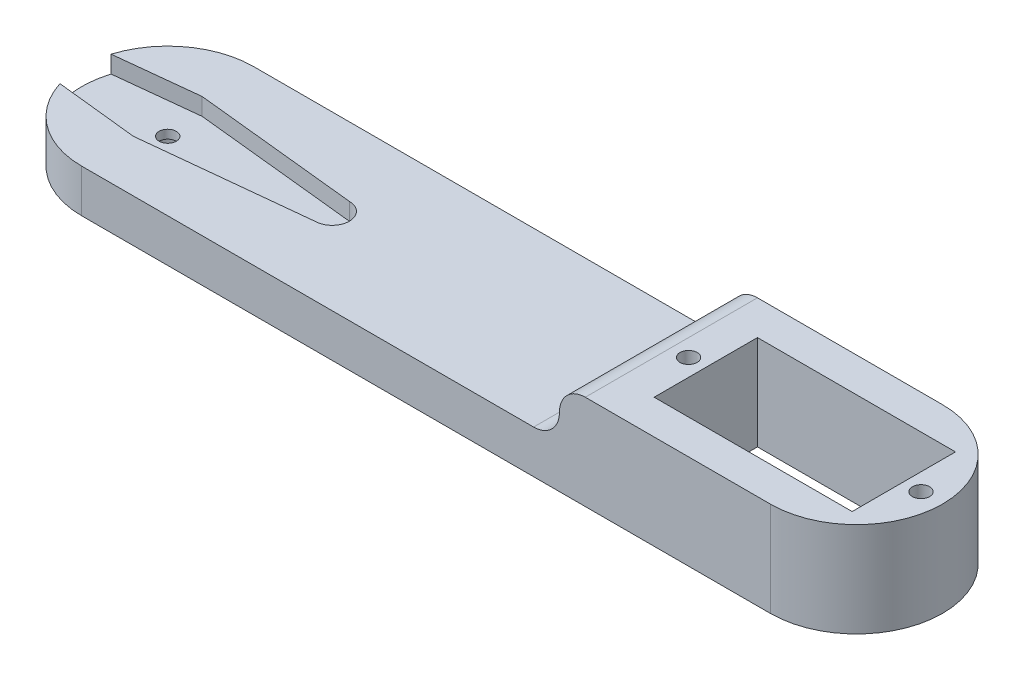
ISO-10303-21;
HEADER;
FILE_DESCRIPTION(('STEP AP214'),'2;1');
FILE_NAME('part.step','',(''),(''),'','','');
FILE_SCHEMA(('AUTOMOTIVE_DESIGN { 1 0 10303 214 1 1 1 1 }'));
ENDSEC;
DATA;
#1=APPLICATION_CONTEXT('core data for automotive mechanical design processes');
#2=APPLICATION_PROTOCOL_DEFINITION('international standard','automotive_design',2000,#1);
#3=PRODUCT_CONTEXT('',#1,'mechanical');
#4=PRODUCT('Part','Part','',(#3));
#5=PRODUCT_RELATED_PRODUCT_CATEGORY('part','',(#4));
#6=PRODUCT_DEFINITION_FORMATION('','',#4);
#7=PRODUCT_DEFINITION_CONTEXT('part definition',#1,'design');
#8=PRODUCT_DEFINITION('design','',#6,#7);
#9=PRODUCT_DEFINITION_SHAPE('','',#8);
#10=(LENGTH_UNIT() NAMED_UNIT(*) SI_UNIT(.MILLI.,.METRE.));
#11=(NAMED_UNIT(*) PLANE_ANGLE_UNIT() SI_UNIT($,.RADIAN.));
#12=(NAMED_UNIT(*) SI_UNIT($,.STERADIAN.) SOLID_ANGLE_UNIT());
#13=UNCERTAINTY_MEASURE_WITH_UNIT(LENGTH_MEASURE(1.E-05),#10,'distance_accuracy_value','');
#14=(GEOMETRIC_REPRESENTATION_CONTEXT(3) GLOBAL_UNCERTAINTY_ASSIGNED_CONTEXT((#13)) GLOBAL_UNIT_ASSIGNED_CONTEXT((#10,
#11,#12)) REPRESENTATION_CONTEXT('',''));
#15=CARTESIAN_POINT('',(0.,0.,0.));
#16=DIRECTION('',(0.,0.,1.));
#17=DIRECTION('',(1.,0.,0.));
#18=AXIS2_PLACEMENT_3D('',#15,#16,#17);
#19=CARTESIAN_POINT('',(47.5,0.,0.));
#20=DIRECTION('',(0.,1.,0.));
#21=DIRECTION('',(0.,0.,1.));
#22=AXIS2_PLACEMENT_3D('',#19,#20,#21);
#23=CYLINDRICAL_SURFACE('',#22,0.999999999999998);
#24=CARTESIAN_POINT('',(47.5,11.,0.));
#25=DIRECTION('',(0.,1.,0.));
#26=DIRECTION('',(0.,0.,1.));
#27=AXIS2_PLACEMENT_3D('',#24,#25,#26);
#28=CIRCLE('',#27,0.999999999999998);
#29=CARTESIAN_POINT('',(47.5,11.,0.999999999999998));
#30=VERTEX_POINT('',#29);
#31=EDGE_CURVE('E248',#30,#30,#28,.T.);
#32=ORIENTED_EDGE('',*,*,#31,.T.);
#33=EDGE_LOOP('',(#32));
#34=FACE_BOUND('',#33,.T.);
#35=CARTESIAN_POINT('',(47.5,4.,0.));
#36=DIRECTION('',(0.,-1.,0.));
#37=DIRECTION('',(0.,0.,-1.));
#38=AXIS2_PLACEMENT_3D('',#35,#36,#37);
#39=CIRCLE('',#38,0.999999999999998);
#40=CARTESIAN_POINT('',(47.5,4.,-0.999999999999998));
#41=VERTEX_POINT('',#40);
#42=EDGE_CURVE('E96',#41,#41,#39,.F.);
#43=ORIENTED_EDGE('',*,*,#42,.F.);
#44=EDGE_LOOP('',(#43));
#45=FACE_BOUND('',#44,.T.);
#46=ADVANCED_FACE('F92',(#34,#45),#23,.F.);
#47=CARTESIAN_POINT('',(20.5,0.,0.));
#48=DIRECTION('',(0.,1.,0.));
#49=DIRECTION('',(0.,0.,1.));
#50=AXIS2_PLACEMENT_3D('',#47,#48,#49);
#51=CYLINDRICAL_SURFACE('',#50,1.);
#52=CARTESIAN_POINT('',(20.5,11.,0.));
#53=DIRECTION('',(0.,1.,0.));
#54=DIRECTION('',(0.,0.,1.));
#55=AXIS2_PLACEMENT_3D('',#52,#53,#54);
#56=CIRCLE('',#55,1.);
#57=CARTESIAN_POINT('',(20.5,11.,1.));
#58=VERTEX_POINT('',#57);
#59=EDGE_CURVE('E252',#58,#58,#56,.T.);
#60=ORIENTED_EDGE('',*,*,#59,.T.);
#61=EDGE_LOOP('',(#60));
#62=FACE_BOUND('',#61,.T.);
#63=CARTESIAN_POINT('',(20.5,4.,0.));
#64=DIRECTION('',(0.,-1.,0.));
#65=DIRECTION('',(0.,0.,-1.));
#66=AXIS2_PLACEMENT_3D('',#63,#64,#65);
#67=CIRCLE('',#66,1.);
#68=CARTESIAN_POINT('',(20.5,4.,-1.));
#69=VERTEX_POINT('',#68);
#70=EDGE_CURVE('E422',#69,#69,#67,.F.);
#71=ORIENTED_EDGE('',*,*,#70,.F.);
#72=EDGE_LOOP('',(#71));
#73=FACE_BOUND('',#72,.T.);
#74=ADVANCED_FACE('F531',(#62,#73),#51,.F.);
#75=CARTESIAN_POINT('',(12.5013276464842,8.,-10.));
#76=DIRECTION('',(0.,0.,1.));
#77=DIRECTION('',(1.,0.,0.));
#78=AXIS2_PLACEMENT_3D('',#75,#76,#77);
#79=CYLINDRICAL_SURFACE('',#78,3.);
#80=DIRECTION('',(0.,0.,1.));
#81=VECTOR('',#80,1.);
#82=CARTESIAN_POINT('',(12.5013276464842,5.,0.));
#83=LINE('',#82,#81);
#84=CARTESIAN_POINT('',(12.5013276464842,5.,10.));
#85=VERTEX_POINT('',#84);
#86=CARTESIAN_POINT('',(12.5013276464841,5.,-10.));
#87=VERTEX_POINT('',#86);
#88=EDGE_CURVE('E418',#85,#87,#83,.F.);
#89=ORIENTED_EDGE('',*,*,#88,.F.);
#90=CARTESIAN_POINT('',(12.5013276464842,8.,10.));
#91=DIRECTION('',(0.,0.,-1.));
#92=DIRECTION('',(-1.,0.,0.));
#93=AXIS2_PLACEMENT_3D('',#90,#91,#92);
#94=CIRCLE('',#93,3.);
#95=CARTESIAN_POINT('',(15.5013276464842,8.,10.));
#96=VERTEX_POINT('',#95);
#97=EDGE_CURVE('E12',#85,#96,#94,.F.);
#98=ORIENTED_EDGE('',*,*,#97,.T.);
#99=DIRECTION('',(0.,0.,1.));
#100=VECTOR('',#99,1.);
#101=CARTESIAN_POINT('',(15.5013276464842,8.,0.));
#102=LINE('',#101,#100);
#103=CARTESIAN_POINT('',(15.5013276464842,8.,-10.));
#104=VERTEX_POINT('',#103);
#105=EDGE_CURVE('E409',#96,#104,#102,.F.);
#106=ORIENTED_EDGE('',*,*,#105,.T.);
#107=CARTESIAN_POINT('',(12.5013276464842,8.,-10.));
#108=DIRECTION('',(0.,0.,1.));
#109=DIRECTION('',(1.,0.,0.));
#110=AXIS2_PLACEMENT_3D('',#107,#108,#109);
#111=CIRCLE('',#110,3.);
#112=EDGE_CURVE('E102',#104,#87,#111,.F.);
#113=ORIENTED_EDGE('',*,*,#112,.T.);
#114=EDGE_LOOP('',(#89,#98,#106,#113));
#115=FACE_BOUND('',#114,.T.);
#116=ADVANCED_FACE('F94',(#115),#79,.F.);
#117=CARTESIAN_POINT('',(18.5013276464842,8.,0.));
#118=DIRECTION('',(0.,0.,-1.));
#119=DIRECTION('',(-1.,0.,0.));
#120=AXIS2_PLACEMENT_3D('',#117,#118,#119);
#121=CYLINDRICAL_SURFACE('',#120,3.);
#122=DIRECTION('',(0.,0.,1.));
#123=VECTOR('',#122,1.);
#124=CARTESIAN_POINT('',(18.5013276464842,11.,0.));
#125=LINE('',#124,#123);
#126=CARTESIAN_POINT('',(18.5013276464842,11.,-10.));
#127=VERTEX_POINT('',#126);
#128=CARTESIAN_POINT('',(18.5013276464842,11.,10.));
#129=VERTEX_POINT('',#128);
#130=EDGE_CURVE('E399',#127,#129,#125,.T.);
#131=ORIENTED_EDGE('',*,*,#130,.F.);
#132=CARTESIAN_POINT('',(18.5013276464842,8.,-10.));
#133=DIRECTION('',(0.,0.,1.));
#134=DIRECTION('',(1.,0.,0.));
#135=AXIS2_PLACEMENT_3D('',#132,#133,#134);
#136=CIRCLE('',#135,3.);
#137=EDGE_CURVE('E412',#104,#127,#136,.F.);
#138=ORIENTED_EDGE('',*,*,#137,.F.);
#139=ORIENTED_EDGE('',*,*,#105,.F.);
#140=CARTESIAN_POINT('',(18.5013276464842,8.,10.));
#141=DIRECTION('',(0.,0.,-1.));
#142=DIRECTION('',(-1.,0.,0.));
#143=AXIS2_PLACEMENT_3D('',#140,#141,#142);
#144=CIRCLE('',#143,3.);
#145=EDGE_CURVE('E415',#129,#96,#144,.F.);
#146=ORIENTED_EDGE('',*,*,#145,.F.);
#147=EDGE_LOOP('',(#131,#138,#139,#146));
#148=FACE_BOUND('',#147,.T.);
#149=ADVANCED_FACE('F475',(#148),#121,.T.);
#150=CARTESIAN_POINT('',(-40.,0.,0.));
#151=DIRECTION('',(0.,1.,0.));
#152=DIRECTION('',(0.,0.,1.));
#153=AXIS2_PLACEMENT_3D('',#150,#151,#152);
#154=CYLINDRICAL_SURFACE('',#153,0.999999999999998);
#155=CARTESIAN_POINT('',(-40.,3.,0.));
#156=DIRECTION('',(0.,1.,0.));
#157=DIRECTION('',(0.,0.,1.));
#158=AXIS2_PLACEMENT_3D('',#155,#156,#157);
#159=CIRCLE('',#158,0.999999999999998);
#160=CARTESIAN_POINT('',(-40.,3.,0.999999999999998));
#161=VERTEX_POINT('',#160);
#162=EDGE_CURVE('E323',#161,#161,#159,.T.);
#163=ORIENTED_EDGE('',*,*,#162,.T.);
#164=EDGE_LOOP('',(#163));
#165=FACE_BOUND('',#164,.T.);
#166=CARTESIAN_POINT('',(-40.,2.,0.));
#167=DIRECTION('',(0.,-1.,0.));
#168=DIRECTION('',(0.,0.,-1.));
#169=AXIS2_PLACEMENT_3D('',#166,#167,#168);
#170=CIRCLE('',#169,0.999999999999998);
#171=CARTESIAN_POINT('',(-40.,2.,-0.999999999999998));
#172=VERTEX_POINT('',#171);
#173=EDGE_CURVE('E291',#172,#172,#170,.F.);
#174=ORIENTED_EDGE('',*,*,#173,.F.);
#175=EDGE_LOOP('',(#174));
#176=FACE_BOUND('',#175,.T.);
#177=ADVANCED_FACE('F563',(#165,#176),#154,.F.);
#178=CARTESIAN_POINT('',(-40.,5.,0.));
#179=DIRECTION('',(0.,-1.,0.));
#180=DIRECTION('',(0.,0.,-1.));
#181=AXIS2_PLACEMENT_3D('',#178,#179,#180);
#182=CYLINDRICAL_SURFACE('',#181,10.);
#183=DIRECTION('',(0.,1.,0.));
#184=VECTOR('',#183,1.);
#185=CARTESIAN_POINT('',(-49.5495147182902,3.,2.96762003045511));
#186=LINE('',#185,#184);
#187=CARTESIAN_POINT('',(-49.5495147182902,3.,2.96762003045511));
#188=VERTEX_POINT('',#187);
#189=CARTESIAN_POINT('',(-49.5495147182902,5.,2.96762003045511));
#190=VERTEX_POINT('',#189);
#191=EDGE_CURVE('E343',#188,#190,#186,.T.);
#192=ORIENTED_EDGE('',*,*,#191,.F.);
#193=CARTESIAN_POINT('',(-40.,3.,0.));
#194=DIRECTION('',(0.,1.,0.));
#195=DIRECTION('',(0.,0.,1.));
#196=AXIS2_PLACEMENT_3D('',#193,#194,#195);
#197=CIRCLE('',#196,10.);
#198=CARTESIAN_POINT('',(-49.5495147182902,3.,-2.96762003045511));
#199=VERTEX_POINT('',#198);
#200=EDGE_CURVE('E310',#199,#188,#197,.T.);
#201=ORIENTED_EDGE('',*,*,#200,.F.);
#202=DIRECTION('',(0.,1.,0.));
#203=VECTOR('',#202,1.);
#204=CARTESIAN_POINT('',(-49.5495147182902,3.,-2.96762003045511));
#205=LINE('',#204,#203);
#206=CARTESIAN_POINT('',(-49.5495147182902,5.,-2.96762003045511));
#207=VERTEX_POINT('',#206);
#208=EDGE_CURVE('E346',#199,#207,#205,.T.);
#209=ORIENTED_EDGE('',*,*,#208,.T.);
#210=CARTESIAN_POINT('',(-40.,5.,0.));
#211=DIRECTION('',(0.,1.,0.));
#212=DIRECTION('',(0.,0.,1.));
#213=AXIS2_PLACEMENT_3D('',#210,#211,#212);
#214=CIRCLE('',#213,10.);
#215=CARTESIAN_POINT('',(-40.,5.,-10.));
#216=VERTEX_POINT('',#215);
#217=EDGE_CURVE('E364',#216,#207,#214,.T.);
#218=ORIENTED_EDGE('',*,*,#217,.F.);
#219=DIRECTION('',(0.,-1.,0.));
#220=VECTOR('',#219,1.);
#221=CARTESIAN_POINT('',(-40.,5.,-10.));
#222=LINE('',#221,#220);
#223=CARTESIAN_POINT('',(-40.,0.,-10.));
#224=VERTEX_POINT('',#223);
#225=EDGE_CURVE('E391',#216,#224,#222,.T.);
#226=ORIENTED_EDGE('',*,*,#225,.T.);
#227=CARTESIAN_POINT('',(-40.,0.,0.));
#228=DIRECTION('',(0.,1.,0.));
#229=DIRECTION('',(0.,0.,1.));
#230=AXIS2_PLACEMENT_3D('',#227,#228,#229);
#231=CIRCLE('',#230,10.);
#232=CARTESIAN_POINT('',(-40.,0.,10.));
#233=VERTEX_POINT('',#232);
#234=EDGE_CURVE('E379',#224,#233,#231,.T.);
#235=ORIENTED_EDGE('',*,*,#234,.T.);
#236=DIRECTION('',(0.,-1.,0.));
#237=VECTOR('',#236,1.);
#238=CARTESIAN_POINT('',(-40.,5.,10.));
#239=LINE('',#238,#237);
#240=CARTESIAN_POINT('',(-40.,5.,10.));
#241=VERTEX_POINT('',#240);
#242=EDGE_CURVE('E387',#241,#233,#239,.T.);
#243=ORIENTED_EDGE('',*,*,#242,.F.);
#244=EDGE_CURVE('E362',#190,#241,#214,.T.);
#245=ORIENTED_EDGE('',*,*,#244,.F.);
#246=EDGE_LOOP('',(#192,#201,#209,#218,#226,#235,#243,#245));
#247=FACE_BOUND('',#246,.T.);
#248=ADVANCED_FACE('F490',(#247),#182,.T.);
#249=CARTESIAN_POINT('',(40.,5.,0.));
#250=DIRECTION('',(0.,1.,0.));
#251=DIRECTION('',(0.,0.,1.));
#252=AXIS2_PLACEMENT_3D('',#249,#250,#251);
#253=PLANE('',#252);
#254=DIRECTION('',(1.,0.,0.));
#255=VECTOR('',#254,1.);
#256=CARTESIAN_POINT('',(-40.,5.,10.));
#257=LINE('',#256,#255);
#258=EDGE_CURVE('E368',#241,#85,#257,.T.);
#259=ORIENTED_EDGE('',*,*,#258,.T.);
#260=ORIENTED_EDGE('',*,*,#88,.T.);
#261=DIRECTION('',(-1.,0.,0.));
#262=VECTOR('',#261,1.);
#263=CARTESIAN_POINT('',(-40.,5.,-10.));
#264=LINE('',#263,#262);
#265=EDGE_CURVE('E359',#87,#216,#264,.T.);
#266=ORIENTED_EDGE('',*,*,#265,.T.);
#267=ORIENTED_EDGE('',*,*,#217,.T.);
#268=DIRECTION('',(0.994207047565849,0.,-0.107481842980092));
#269=VECTOR('',#268,1.);
#270=CARTESIAN_POINT('',(-0.889530685920576,5.,-8.22815884476534));
#271=LINE('',#270,#269);
#272=CARTESIAN_POINT('',(-39.9999999999999,5.,-4.00000000000001));
#273=VERTEX_POINT('',#272);
#274=EDGE_CURVE('E331',#207,#273,#271,.T.);
#275=ORIENTED_EDGE('',*,*,#274,.T.);
#276=DIRECTION('',(0.994559064630482,0.,0.10417421447432));
#277=VECTOR('',#276,1.);
#278=CARTESIAN_POINT('',(-0.0196610412288855,5.,0.187705440093161));
#279=LINE('',#278,#277);
#280=CARTESIAN_POINT('',(-20.9058495012685,5.,-2.00000000000118));
#281=VERTEX_POINT('',#280);
#282=EDGE_CURVE('E327',#273,#281,#279,.T.);
#283=ORIENTED_EDGE('',*,*,#282,.T.);
#284=CARTESIAN_POINT('',(-20.9058495012685,5.,-1.17831092105725E-12));
#285=DIRECTION('',(0.,1.,0.));
#286=DIRECTION('',(0.,0.,1.));
#287=AXIS2_PLACEMENT_3D('',#284,#285,#286);
#288=CIRCLE('',#287,2.);
#289=CARTESIAN_POINT('',(-20.9058495012685,5.,1.99999999999882));
#290=VERTEX_POINT('',#289);
#291=EDGE_CURVE('E322',#290,#281,#288,.T.);
#292=ORIENTED_EDGE('',*,*,#291,.F.);
#293=DIRECTION('',(-0.994559064630469,0.,0.104174214474442));
#294=VECTOR('',#293,1.);
#295=CARTESIAN_POINT('',(-0.0196610412294196,5.,-0.18770544009804));
#296=LINE('',#295,#294);
#297=CARTESIAN_POINT('',(-39.9999999999999,5.,4.00000000000001));
#298=VERTEX_POINT('',#297);
#299=EDGE_CURVE('E318',#290,#298,#296,.T.);
#300=ORIENTED_EDGE('',*,*,#299,.T.);
#301=DIRECTION('',(-0.994207047565849,0.,-0.107481842980092));
#302=VECTOR('',#301,1.);
#303=CARTESIAN_POINT('',(-0.889530685920576,5.,8.22815884476534));
#304=LINE('',#303,#302);
#305=EDGE_CURVE('E300',#298,#190,#304,.T.);
#306=ORIENTED_EDGE('',*,*,#305,.T.);
#307=ORIENTED_EDGE('',*,*,#244,.T.);
#308=EDGE_LOOP('',(#259,#260,#266,#267,#275,#283,#292,#300,#306,#307));
#309=FACE_BOUND('',#308,.T.);
#310=ADVANCED_FACE('F494',(#309),#253,.T.);
#311=CARTESIAN_POINT('',(40.,5.,0.));
#312=DIRECTION('',(0.,-1.,0.));
#313=DIRECTION('',(0.,0.,-1.));
#314=AXIS2_PLACEMENT_3D('',#311,#312,#313);
#315=CYLINDRICAL_SURFACE('',#314,10.);
#316=CARTESIAN_POINT('',(40.,0.,0.));
#317=DIRECTION('',(0.,1.,0.));
#318=DIRECTION('',(0.,0.,1.));
#319=AXIS2_PLACEMENT_3D('',#316,#317,#318);
#320=CIRCLE('',#319,10.);
#321=CARTESIAN_POINT('',(40.,0.,10.));
#322=VERTEX_POINT('',#321);
#323=CARTESIAN_POINT('',(40.,0.,-10.));
#324=VERTEX_POINT('',#323);
#325=EDGE_CURVE('E342',#322,#324,#320,.T.);
#326=ORIENTED_EDGE('',*,*,#325,.T.);
#327=DIRECTION('',(0.,-1.,0.));
#328=VECTOR('',#327,1.);
#329=CARTESIAN_POINT('',(40.,5.,-10.));
#330=LINE('',#329,#328);
#331=CARTESIAN_POINT('',(40.,11.,-10.));
#332=VERTEX_POINT('',#331);
#333=EDGE_CURVE('E395',#332,#324,#330,.T.);
#334=ORIENTED_EDGE('',*,*,#333,.F.);
#335=CARTESIAN_POINT('',(40.,11.,0.));
#336=DIRECTION('',(0.,1.,0.));
#337=DIRECTION('',(0.,0.,1.));
#338=AXIS2_PLACEMENT_3D('',#335,#336,#337);
#339=CIRCLE('',#338,10.);
#340=CARTESIAN_POINT('',(40.,11.,10.));
#341=VERTEX_POINT('',#340);
#342=EDGE_CURVE('E259',#341,#332,#339,.T.);
#343=ORIENTED_EDGE('',*,*,#342,.F.);
#344=DIRECTION('',(0.,-1.,0.));
#345=VECTOR('',#344,1.);
#346=CARTESIAN_POINT('',(40.,5.,10.));
#347=LINE('',#346,#345);
#348=EDGE_CURVE('E372',#341,#322,#347,.T.);
#349=ORIENTED_EDGE('',*,*,#348,.T.);
#350=EDGE_LOOP('',(#326,#334,#343,#349));
#351=FACE_BOUND('',#350,.T.);
#352=ADVANCED_FACE('F466',(#351),#315,.T.);
#353=CARTESIAN_POINT('',(-40.,5.,-10.));
#354=DIRECTION('',(0.,0.,1.));
#355=DIRECTION('',(1.,0.,0.));
#356=AXIS2_PLACEMENT_3D('',#353,#354,#355);
#357=PLANE('',#356);
#358=CARTESIAN_POINT('',(0.,2.5,-10.));
#359=DIRECTION('',(0.,0.,-1.));
#360=DIRECTION('',(-1.,0.,0.));
#361=AXIS2_PLACEMENT_3D('',#358,#359,#360);
#362=CIRCLE('',#361,1.75);
#363=CARTESIAN_POINT('',(-1.74999999999999,2.5,-10.));
#364=VERTEX_POINT('',#363);
#365=EDGE_CURVE('E441',#364,#364,#362,.T.);
#366=ORIENTED_EDGE('',*,*,#365,.F.);
#367=EDGE_LOOP('',(#366));
#368=FACE_BOUND('',#367,.T.);
#369=ORIENTED_EDGE('',*,*,#112,.F.);
#370=ORIENTED_EDGE('',*,*,#137,.T.);
#371=DIRECTION('',(-1.,0.,0.));
#372=VECTOR('',#371,1.);
#373=CARTESIAN_POINT('',(40.,11.,-10.));
#374=LINE('',#373,#372);
#375=EDGE_CURVE('E263',#332,#127,#374,.T.);
#376=ORIENTED_EDGE('',*,*,#375,.F.);
#377=ORIENTED_EDGE('',*,*,#333,.T.);
#378=DIRECTION('',(-1.,0.,0.));
#379=VECTOR('',#378,1.);
#380=CARTESIAN_POINT('',(-40.,0.,-10.));
#381=LINE('',#380,#379);
#382=EDGE_CURVE('E376',#324,#224,#381,.T.);
#383=ORIENTED_EDGE('',*,*,#382,.T.);
#384=ORIENTED_EDGE('',*,*,#225,.F.);
#385=ORIENTED_EDGE('',*,*,#265,.F.);
#386=EDGE_LOOP('',(#369,#370,#376,#377,#383,#384,#385));
#387=FACE_BOUND('',#386,.T.);
#388=ADVANCED_FACE('F462',(#368,#387),#357,.F.);
#389=CARTESIAN_POINT('',(-40.,5.,10.));
#390=DIRECTION('',(0.,0.,-1.));
#391=DIRECTION('',(-1.,0.,0.));
#392=AXIS2_PLACEMENT_3D('',#389,#390,#391);
#393=PLANE('',#392);
#394=DIRECTION('',(1.,0.,0.));
#395=VECTOR('',#394,1.);
#396=CARTESIAN_POINT('',(15.5013276464842,11.,10.));
#397=LINE('',#396,#395);
#398=EDGE_CURVE('E256',#129,#341,#397,.T.);
#399=ORIENTED_EDGE('',*,*,#398,.F.);
#400=ORIENTED_EDGE('',*,*,#145,.T.);
#401=ORIENTED_EDGE('',*,*,#97,.F.);
#402=ORIENTED_EDGE('',*,*,#258,.F.);
#403=ORIENTED_EDGE('',*,*,#242,.T.);
#404=DIRECTION('',(1.,0.,0.));
#405=VECTOR('',#404,1.);
#406=CARTESIAN_POINT('',(-40.,0.,10.));
#407=LINE('',#406,#405);
#408=EDGE_CURVE('E363',#233,#322,#407,.T.);
#409=ORIENTED_EDGE('',*,*,#408,.T.);
#410=ORIENTED_EDGE('',*,*,#348,.F.);
#411=EDGE_LOOP('',(#399,#400,#401,#402,#403,#409,#410));
#412=FACE_BOUND('',#411,.T.);
#413=ADVANCED_FACE('F465',(#412),#393,.F.);
#414=CARTESIAN_POINT('',(40.,0.,0.));
#415=DIRECTION('',(0.,1.,0.));
#416=DIRECTION('',(0.,0.,1.));
#417=AXIS2_PLACEMENT_3D('',#414,#415,#416);
#418=PLANE('',#417);
#419=CARTESIAN_POINT('',(20.5,0.,0.));
#420=DIRECTION('',(0.,-1.,0.));
#421=DIRECTION('',(0.,0.,-1.));
#422=AXIS2_PLACEMENT_3D('',#419,#420,#421);
#423=CIRCLE('',#422,1.5);
#424=CARTESIAN_POINT('',(20.5,0.,-1.5));
#425=VERTEX_POINT('',#424);
#426=EDGE_CURVE('E432',#425,#425,#423,.T.);
#427=ORIENTED_EDGE('',*,*,#426,.F.);
#428=EDGE_LOOP('',(#427));
#429=FACE_BOUND('',#428,.T.);
#430=CARTESIAN_POINT('',(47.5,0.,0.));
#431=DIRECTION('',(0.,-1.,0.));
#432=DIRECTION('',(0.,0.,-1.));
#433=AXIS2_PLACEMENT_3D('',#430,#431,#432);
#434=CIRCLE('',#433,1.5);
#435=CARTESIAN_POINT('',(47.5,0.,-1.5));
#436=VERTEX_POINT('',#435);
#437=EDGE_CURVE('E446',#436,#436,#434,.T.);
#438=ORIENTED_EDGE('',*,*,#437,.F.);
#439=EDGE_LOOP('',(#438));
#440=FACE_BOUND('',#439,.T.);
#441=DIRECTION('',(1.,0.,0.));
#442=VECTOR('',#441,1.);
#443=CARTESIAN_POINT('',(0.,0.,-6.));
#444=LINE('',#443,#442);
#445=CARTESIAN_POINT('',(22.5,0.,-6.));
#446=VERTEX_POINT('',#445);
#447=CARTESIAN_POINT('',(45.5,0.,-6.));
#448=VERTEX_POINT('',#447);
#449=EDGE_CURVE('E276',#446,#448,#444,.T.);
#450=ORIENTED_EDGE('',*,*,#449,.F.);
#451=DIRECTION('',(0.,0.,1.));
#452=VECTOR('',#451,1.);
#453=CARTESIAN_POINT('',(22.5,0.,0.));
#454=LINE('',#453,#452);
#455=CARTESIAN_POINT('',(22.5,0.,6.));
#456=VERTEX_POINT('',#455);
#457=EDGE_CURVE('E267',#446,#456,#454,.T.);
#458=ORIENTED_EDGE('',*,*,#457,.T.);
#459=DIRECTION('',(1.,0.,0.));
#460=VECTOR('',#459,1.);
#461=CARTESIAN_POINT('',(0.,0.,6.));
#462=LINE('',#461,#460);
#463=CARTESIAN_POINT('',(45.5,0.,6.));
#464=VERTEX_POINT('',#463);
#465=EDGE_CURVE('E271',#456,#464,#462,.T.);
#466=ORIENTED_EDGE('',*,*,#465,.T.);
#467=DIRECTION('',(0.,0.,1.));
#468=VECTOR('',#467,1.);
#469=CARTESIAN_POINT('',(45.5,0.,0.));
#470=LINE('',#469,#468);
#471=EDGE_CURVE('E220',#448,#464,#470,.T.);
#472=ORIENTED_EDGE('',*,*,#471,.F.);
#473=EDGE_LOOP('',(#450,#458,#466,#472));
#474=FACE_BOUND('',#473,.T.);
#475=CARTESIAN_POINT('',(-40.,0.,0.));
#476=DIRECTION('',(0.,-1.,0.));
#477=DIRECTION('',(0.,0.,-1.));
#478=AXIS2_PLACEMENT_3D('',#475,#476,#477);
#479=CIRCLE('',#478,3.);
#480=CARTESIAN_POINT('',(-40.,0.,-3.));
#481=VERTEX_POINT('',#480);
#482=EDGE_CURVE('E282',#481,#481,#479,.T.);
#483=ORIENTED_EDGE('',*,*,#482,.F.);
#484=EDGE_LOOP('',(#483));
#485=FACE_BOUND('',#484,.T.);
#486=ORIENTED_EDGE('',*,*,#325,.F.);
#487=ORIENTED_EDGE('',*,*,#408,.F.);
#488=ORIENTED_EDGE('',*,*,#234,.F.);
#489=ORIENTED_EDGE('',*,*,#382,.F.);
#490=EDGE_LOOP('',(#486,#487,#488,#489));
#491=FACE_BOUND('',#490,.T.);
#492=ADVANCED_FACE('F485',(#429,#440,#474,#485,#491),#418,.F.);
#493=CARTESIAN_POINT('',(-0.0196610412294196,3.,-0.18770544009804));
#494=DIRECTION('',(-0.104174214474442,0.,-0.994559064630469));
#495=DIRECTION('',(-0.994559064630469,0.,0.104174214474442));
#496=AXIS2_PLACEMENT_3D('',#493,#494,#495);
#497=PLANE('',#496);
#498=ORIENTED_EDGE('',*,*,#299,.F.);
#499=DIRECTION('',(0.,1.,0.));
#500=VECTOR('',#499,1.);
#501=CARTESIAN_POINT('',(-20.9058495012685,3.,1.99999999999882));
#502=LINE('',#501,#500);
#503=CARTESIAN_POINT('',(-20.9058495012685,3.,1.99999999999882));
#504=VERTEX_POINT('',#503);
#505=EDGE_CURVE('E317',#504,#290,#502,.T.);
#506=ORIENTED_EDGE('',*,*,#505,.F.);
#507=DIRECTION('',(-0.994559064630469,0.,0.104174214474442));
#508=VECTOR('',#507,1.);
#509=CARTESIAN_POINT('',(-0.0196610412294196,3.,-0.18770544009804));
#510=LINE('',#509,#508);
#511=CARTESIAN_POINT('',(-39.9999999999999,3.,4.00000000000001));
#512=VERTEX_POINT('',#511);
#513=EDGE_CURVE('E295',#504,#512,#510,.T.);
#514=ORIENTED_EDGE('',*,*,#513,.T.);
#515=DIRECTION('',(0.,1.,0.));
#516=VECTOR('',#515,1.);
#517=CARTESIAN_POINT('',(-39.9999999999999,3.,4.00000000000001));
#518=LINE('',#517,#516);
#519=EDGE_CURVE('E338',#512,#298,#518,.T.);
#520=ORIENTED_EDGE('',*,*,#519,.T.);
#521=EDGE_LOOP('',(#498,#506,#514,#520));
#522=FACE_BOUND('',#521,.T.);
#523=ADVANCED_FACE('F517',(#522),#497,.T.);
#524=CARTESIAN_POINT('',(-0.889530685920576,3.,8.22815884476534));
#525=DIRECTION('',(0.107481842980092,0.,-0.994207047565849));
#526=DIRECTION('',(-0.994207047565849,0.,-0.107481842980092));
#527=AXIS2_PLACEMENT_3D('',#524,#525,#526);
#528=PLANE('',#527);
#529=ORIENTED_EDGE('',*,*,#305,.F.);
#530=ORIENTED_EDGE('',*,*,#519,.F.);
#531=DIRECTION('',(-0.994207047565849,0.,-0.107481842980092));
#532=VECTOR('',#531,1.);
#533=CARTESIAN_POINT('',(-0.889530685920576,3.,8.22815884476534));
#534=LINE('',#533,#532);
#535=EDGE_CURVE('E314',#512,#188,#534,.T.);
#536=ORIENTED_EDGE('',*,*,#535,.T.);
#537=ORIENTED_EDGE('',*,*,#191,.T.);
#538=EDGE_LOOP('',(#529,#530,#536,#537));
#539=FACE_BOUND('',#538,.T.);
#540=ADVANCED_FACE('F498',(#539),#528,.T.);
#541=CARTESIAN_POINT('',(-0.889530685920576,3.,-8.22815884476534));
#542=DIRECTION('',(0.107481842980092,0.,0.994207047565849));
#543=DIRECTION('',(0.994207047565849,0.,-0.107481842980092));
#544=AXIS2_PLACEMENT_3D('',#541,#542,#543);
#545=PLANE('',#544);
#546=ORIENTED_EDGE('',*,*,#274,.F.);
#547=ORIENTED_EDGE('',*,*,#208,.F.);
#548=DIRECTION('',(0.994207047565849,0.,-0.107481842980092));
#549=VECTOR('',#548,1.);
#550=CARTESIAN_POINT('',(-0.889530685920576,3.,-8.22815884476534));
#551=LINE('',#550,#549);
#552=CARTESIAN_POINT('',(-39.9999999999999,3.,-4.00000000000001));
#553=VERTEX_POINT('',#552);
#554=EDGE_CURVE('E307',#199,#553,#551,.T.);
#555=ORIENTED_EDGE('',*,*,#554,.T.);
#556=DIRECTION('',(0.,1.,0.));
#557=VECTOR('',#556,1.);
#558=CARTESIAN_POINT('',(-39.9999999999999,3.,-4.00000000000001));
#559=LINE('',#558,#557);
#560=EDGE_CURVE('E350',#553,#273,#559,.T.);
#561=ORIENTED_EDGE('',*,*,#560,.T.);
#562=EDGE_LOOP('',(#546,#547,#555,#561));
#563=FACE_BOUND('',#562,.T.);
#564=ADVANCED_FACE('F507',(#563),#545,.T.);
#565=CARTESIAN_POINT('',(-0.0196610412288855,3.,0.187705440093161));
#566=DIRECTION('',(-0.10417421447432,0.,0.994559064630481));
#567=DIRECTION('',(0.994559064630482,0.,0.10417421447432));
#568=AXIS2_PLACEMENT_3D('',#565,#566,#567);
#569=PLANE('',#568);
#570=ORIENTED_EDGE('',*,*,#282,.F.);
#571=ORIENTED_EDGE('',*,*,#560,.F.);
#572=DIRECTION('',(0.994559064630482,0.,0.10417421447432));
#573=VECTOR('',#572,1.);
#574=CARTESIAN_POINT('',(-0.0196610412288855,3.,0.187705440093161));
#575=LINE('',#574,#573);
#576=CARTESIAN_POINT('',(-20.9058495012685,3.,-2.00000000000118));
#577=VERTEX_POINT('',#576);
#578=EDGE_CURVE('E304',#553,#577,#575,.T.);
#579=ORIENTED_EDGE('',*,*,#578,.T.);
#580=DIRECTION('',(0.,1.,0.));
#581=VECTOR('',#580,1.);
#582=CARTESIAN_POINT('',(-20.9058495012685,3.,-2.00000000000118));
#583=LINE('',#582,#581);
#584=EDGE_CURVE('E353',#577,#281,#583,.T.);
#585=ORIENTED_EDGE('',*,*,#584,.T.);
#586=EDGE_LOOP('',(#570,#571,#579,#585));
#587=FACE_BOUND('',#586,.T.);
#588=ADVANCED_FACE('F510',(#587),#569,.T.);
#589=CARTESIAN_POINT('',(-20.9058495012685,3.,-1.17831092105725E-12));
#590=DIRECTION('',(0.,1.,0.));
#591=DIRECTION('',(0.,0.,1.));
#592=AXIS2_PLACEMENT_3D('',#589,#590,#591);
#593=CYLINDRICAL_SURFACE('',#592,2.);
#594=ORIENTED_EDGE('',*,*,#291,.T.);
#595=ORIENTED_EDGE('',*,*,#584,.F.);
#596=CARTESIAN_POINT('',(-20.9058495012685,3.,-1.17831092105725E-12));
#597=DIRECTION('',(0.,1.,0.));
#598=DIRECTION('',(0.,0.,1.));
#599=AXIS2_PLACEMENT_3D('',#596,#597,#598);
#600=CIRCLE('',#599,2.);
#601=EDGE_CURVE('E299',#504,#577,#600,.T.);
#602=ORIENTED_EDGE('',*,*,#601,.F.);
#603=ORIENTED_EDGE('',*,*,#505,.T.);
#604=EDGE_LOOP('',(#594,#595,#602,#603));
#605=FACE_BOUND('',#604,.T.);
#606=ADVANCED_FACE('F514',(#605),#593,.F.);
#607=CARTESIAN_POINT('',(0.,3.,0.));
#608=DIRECTION('',(0.,1.,0.));
#609=DIRECTION('',(0.,0.,1.));
#610=AXIS2_PLACEMENT_3D('',#607,#608,#609);
#611=PLANE('',#610);
#612=ORIENTED_EDGE('',*,*,#162,.F.);
#613=EDGE_LOOP('',(#612));
#614=FACE_BOUND('',#613,.T.);
#615=ORIENTED_EDGE('',*,*,#513,.F.);
#616=ORIENTED_EDGE('',*,*,#601,.T.);
#617=ORIENTED_EDGE('',*,*,#578,.F.);
#618=ORIENTED_EDGE('',*,*,#554,.F.);
#619=ORIENTED_EDGE('',*,*,#200,.T.);
#620=ORIENTED_EDGE('',*,*,#535,.F.);
#621=EDGE_LOOP('',(#615,#616,#617,#618,#619,#620));
#622=FACE_BOUND('',#621,.T.);
#623=ADVANCED_FACE('F503',(#614,#622),#611,.T.);
#624=CARTESIAN_POINT('',(-40.,2.,0.));
#625=DIRECTION('',(0.,-1.,0.));
#626=DIRECTION('',(0.,0.,-1.));
#627=AXIS2_PLACEMENT_3D('',#624,#625,#626);
#628=PLANE('',#627);
#629=CARTESIAN_POINT('',(-40.,2.,0.));
#630=DIRECTION('',(0.,-1.,0.));
#631=DIRECTION('',(0.,0.,-1.));
#632=AXIS2_PLACEMENT_3D('',#629,#630,#631);
#633=CIRCLE('',#632,3.);
#634=CARTESIAN_POINT('',(-40.,2.,-3.));
#635=VERTEX_POINT('',#634);
#636=EDGE_CURVE('E287',#635,#635,#633,.T.);
#637=ORIENTED_EDGE('',*,*,#636,.T.);
#638=EDGE_LOOP('',(#637));
#639=FACE_BOUND('',#638,.T.);
#640=ORIENTED_EDGE('',*,*,#173,.T.);
#641=EDGE_LOOP('',(#640));
#642=FACE_BOUND('',#641,.T.);
#643=ADVANCED_FACE('F557',(#639,#642),#628,.T.);
#644=CARTESIAN_POINT('',(-40.,2.,0.));
#645=DIRECTION('',(0.,-1.,0.));
#646=DIRECTION('',(0.,0.,-1.));
#647=AXIS2_PLACEMENT_3D('',#644,#645,#646);
#648=CYLINDRICAL_SURFACE('',#647,3.);
#649=ORIENTED_EDGE('',*,*,#636,.F.);
#650=EDGE_LOOP('',(#649));
#651=FACE_BOUND('',#650,.T.);
#652=ORIENTED_EDGE('',*,*,#482,.T.);
#653=EDGE_LOOP('',(#652));
#654=FACE_BOUND('',#653,.T.);
#655=ADVANCED_FACE('F555',(#651,#654),#648,.F.);
#656=CARTESIAN_POINT('',(22.5,0.,0.));
#657=DIRECTION('',(-1.,0.,0.));
#658=DIRECTION('',(0.,0.,1.));
#659=AXIS2_PLACEMENT_3D('',#656,#657,#658);
#660=PLANE('',#659);
#661=DIRECTION('',(0.,1.,0.));
#662=VECTOR('',#661,1.);
#663=CARTESIAN_POINT('',(22.5,0.,-6.));
#664=LINE('',#663,#662);
#665=CARTESIAN_POINT('',(22.5,11.,-6.));
#666=VERTEX_POINT('',#665);
#667=EDGE_CURVE('E279',#446,#666,#664,.T.);
#668=ORIENTED_EDGE('',*,*,#667,.T.);
#669=DIRECTION('',(0.,0.,1.));
#670=VECTOR('',#669,1.);
#671=CARTESIAN_POINT('',(22.5,11.,-6.));
#672=LINE('',#671,#670);
#673=CARTESIAN_POINT('',(22.5,11.,6.));
#674=VERTEX_POINT('',#673);
#675=EDGE_CURVE('E242',#666,#674,#672,.T.);
#676=ORIENTED_EDGE('',*,*,#675,.T.);
#677=DIRECTION('',(0.,1.,0.));
#678=VECTOR('',#677,1.);
#679=CARTESIAN_POINT('',(22.5,0.,6.));
#680=LINE('',#679,#678);
#681=EDGE_CURVE('E226',#456,#674,#680,.T.);
#682=ORIENTED_EDGE('',*,*,#681,.F.);
#683=ORIENTED_EDGE('',*,*,#457,.F.);
#684=EDGE_LOOP('',(#668,#676,#682,#683));
#685=FACE_BOUND('',#684,.T.);
#686=ADVANCED_FACE('F547',(#685),#660,.F.);
#687=CARTESIAN_POINT('',(0.,0.,-6.));
#688=DIRECTION('',(0.,0.,1.));
#689=DIRECTION('',(1.,0.,0.));
#690=AXIS2_PLACEMENT_3D('',#687,#688,#689);
#691=PLANE('',#690);
#692=DIRECTION('',(0.,1.,0.));
#693=VECTOR('',#692,1.);
#694=CARTESIAN_POINT('',(45.5,0.,-6.));
#695=LINE('',#694,#693);
#696=CARTESIAN_POINT('',(45.5,11.,-6.));
#697=VERTEX_POINT('',#696);
#698=EDGE_CURVE('E225',#448,#697,#695,.T.);
#699=ORIENTED_EDGE('',*,*,#698,.T.);
#700=DIRECTION('',(1.,0.,0.));
#701=VECTOR('',#700,1.);
#702=CARTESIAN_POINT('',(22.5,11.,-6.));
#703=LINE('',#702,#701);
#704=EDGE_CURVE('E238',#666,#697,#703,.T.);
#705=ORIENTED_EDGE('',*,*,#704,.F.);
#706=ORIENTED_EDGE('',*,*,#667,.F.);
#707=ORIENTED_EDGE('',*,*,#449,.T.);
#708=EDGE_LOOP('',(#699,#705,#706,#707));
#709=FACE_BOUND('',#708,.T.);
#710=ADVANCED_FACE('F544',(#709),#691,.T.);
#711=CARTESIAN_POINT('',(45.5,0.,0.));
#712=DIRECTION('',(-1.,0.,0.));
#713=DIRECTION('',(0.,0.,1.));
#714=AXIS2_PLACEMENT_3D('',#711,#712,#713);
#715=PLANE('',#714);
#716=DIRECTION('',(0.,1.,0.));
#717=VECTOR('',#716,1.);
#718=CARTESIAN_POINT('',(45.5,0.,6.));
#719=LINE('',#718,#717);
#720=CARTESIAN_POINT('',(45.5,11.,6.));
#721=VERTEX_POINT('',#720);
#722=EDGE_CURVE('E212',#464,#721,#719,.T.);
#723=ORIENTED_EDGE('',*,*,#722,.T.);
#724=DIRECTION('',(0.,0.,1.));
#725=VECTOR('',#724,1.);
#726=CARTESIAN_POINT('',(45.5,11.,-6.));
#727=LINE('',#726,#725);
#728=EDGE_CURVE('E217',#697,#721,#727,.T.);
#729=ORIENTED_EDGE('',*,*,#728,.F.);
#730=ORIENTED_EDGE('',*,*,#698,.F.);
#731=ORIENTED_EDGE('',*,*,#471,.T.);
#732=EDGE_LOOP('',(#723,#729,#730,#731));
#733=FACE_BOUND('',#732,.T.);
#734=ADVANCED_FACE('F214',(#733),#715,.T.);
#735=CARTESIAN_POINT('',(0.,0.,6.));
#736=DIRECTION('',(0.,0.,1.));
#737=DIRECTION('',(1.,0.,0.));
#738=AXIS2_PLACEMENT_3D('',#735,#736,#737);
#739=PLANE('',#738);
#740=ORIENTED_EDGE('',*,*,#681,.T.);
#741=DIRECTION('',(1.,0.,0.));
#742=VECTOR('',#741,1.);
#743=CARTESIAN_POINT('',(22.5,11.,6.));
#744=LINE('',#743,#742);
#745=EDGE_CURVE('E229',#674,#721,#744,.T.);
#746=ORIENTED_EDGE('',*,*,#745,.T.);
#747=ORIENTED_EDGE('',*,*,#722,.F.);
#748=ORIENTED_EDGE('',*,*,#465,.F.);
#749=EDGE_LOOP('',(#740,#746,#747,#748));
#750=FACE_BOUND('',#749,.T.);
#751=ADVANCED_FACE('F230',(#750),#739,.F.);
#752=CARTESIAN_POINT('',(40.,11.,0.));
#753=DIRECTION('',(0.,1.,0.));
#754=DIRECTION('',(0.,0.,1.));
#755=AXIS2_PLACEMENT_3D('',#752,#753,#754);
#756=PLANE('',#755);
#757=ORIENTED_EDGE('',*,*,#59,.F.);
#758=EDGE_LOOP('',(#757));
#759=FACE_BOUND('',#758,.T.);
#760=ORIENTED_EDGE('',*,*,#375,.T.);
#761=ORIENTED_EDGE('',*,*,#130,.T.);
#762=ORIENTED_EDGE('',*,*,#398,.T.);
#763=ORIENTED_EDGE('',*,*,#342,.T.);
#764=EDGE_LOOP('',(#760,#761,#762,#763));
#765=FACE_BOUND('',#764,.T.);
#766=ORIENTED_EDGE('',*,*,#31,.F.);
#767=EDGE_LOOP('',(#766));
#768=FACE_BOUND('',#767,.T.);
#769=ORIENTED_EDGE('',*,*,#728,.T.);
#770=ORIENTED_EDGE('',*,*,#745,.F.);
#771=ORIENTED_EDGE('',*,*,#675,.F.);
#772=ORIENTED_EDGE('',*,*,#704,.T.);
#773=EDGE_LOOP('',(#769,#770,#771,#772));
#774=FACE_BOUND('',#773,.T.);
#775=ADVANCED_FACE('F236',(#759,#765,#768,#774),#756,.T.);
#776=CARTESIAN_POINT('',(20.5,4.,0.));
#777=DIRECTION('',(0.,-1.,0.));
#778=DIRECTION('',(0.,0.,-1.));
#779=AXIS2_PLACEMENT_3D('',#776,#777,#778);
#780=PLANE('',#779);
#781=CARTESIAN_POINT('',(20.5,4.,0.));
#782=DIRECTION('',(0.,-1.,0.));
#783=DIRECTION('',(0.,0.,-1.));
#784=AXIS2_PLACEMENT_3D('',#781,#782,#783);
#785=CIRCLE('',#784,1.5);
#786=CARTESIAN_POINT('',(20.5,4.,-1.5));
#787=VERTEX_POINT('',#786);
#788=EDGE_CURVE('E425',#787,#787,#785,.T.);
#789=ORIENTED_EDGE('',*,*,#788,.T.);
#790=EDGE_LOOP('',(#789));
#791=FACE_BOUND('',#790,.T.);
#792=ORIENTED_EDGE('',*,*,#70,.T.);
#793=EDGE_LOOP('',(#792));
#794=FACE_BOUND('',#793,.T.);
#795=ADVANCED_FACE('F650',(#791,#794),#780,.T.);
#796=CARTESIAN_POINT('',(20.5,4.,0.));
#797=DIRECTION('',(0.,-1.,0.));
#798=DIRECTION('',(0.,0.,-1.));
#799=AXIS2_PLACEMENT_3D('',#796,#797,#798);
#800=CYLINDRICAL_SURFACE('',#799,1.5);
#801=ORIENTED_EDGE('',*,*,#788,.F.);
#802=EDGE_LOOP('',(#801));
#803=FACE_BOUND('',#802,.T.);
#804=ORIENTED_EDGE('',*,*,#426,.T.);
#805=EDGE_LOOP('',(#804));
#806=FACE_BOUND('',#805,.T.);
#807=ADVANCED_FACE('F692',(#803,#806),#800,.F.);
#808=CARTESIAN_POINT('',(47.5,4.,0.));
#809=DIRECTION('',(0.,-1.,0.));
#810=DIRECTION('',(0.,0.,-1.));
#811=AXIS2_PLACEMENT_3D('',#808,#809,#810);
#812=PLANE('',#811);
#813=CARTESIAN_POINT('',(47.5,4.,0.));
#814=DIRECTION('',(0.,-1.,0.));
#815=DIRECTION('',(0.,0.,-1.));
#816=AXIS2_PLACEMENT_3D('',#813,#814,#815);
#817=CIRCLE('',#816,1.5);
#818=CARTESIAN_POINT('',(47.5,4.,-1.5));
#819=VERTEX_POINT('',#818);
#820=EDGE_CURVE('E438',#819,#819,#817,.T.);
#821=ORIENTED_EDGE('',*,*,#820,.T.);
#822=EDGE_LOOP('',(#821));
#823=FACE_BOUND('',#822,.T.);
#824=ORIENTED_EDGE('',*,*,#42,.T.);
#825=EDGE_LOOP('',(#824));
#826=FACE_BOUND('',#825,.T.);
#827=ADVANCED_FACE('F701',(#823,#826),#812,.T.);
#828=CARTESIAN_POINT('',(47.5,4.,0.));
#829=DIRECTION('',(0.,-1.,0.));
#830=DIRECTION('',(0.,0.,-1.));
#831=AXIS2_PLACEMENT_3D('',#828,#829,#830);
#832=CYLINDRICAL_SURFACE('',#831,1.5);
#833=ORIENTED_EDGE('',*,*,#820,.F.);
#834=EDGE_LOOP('',(#833));
#835=FACE_BOUND('',#834,.T.);
#836=ORIENTED_EDGE('',*,*,#437,.T.);
#837=EDGE_LOOP('',(#836));
#838=FACE_BOUND('',#837,.T.);
#839=ADVANCED_FACE('F711',(#835,#838),#832,.F.);
#840=CARTESIAN_POINT('',(0.,2.5,0.));
#841=DIRECTION('',(0.,0.,-1.));
#842=DIRECTION('',(-1.,0.,0.));
#843=AXIS2_PLACEMENT_3D('',#840,#841,#842);
#844=CYLINDRICAL_SURFACE('',#843,1.75);
#845=CARTESIAN_POINT('',(0.,2.5,0.));
#846=DIRECTION('',(0.,0.,-1.));
#847=DIRECTION('',(-1.,0.,0.));
#848=AXIS2_PLACEMENT_3D('',#845,#846,#847);
#849=CIRCLE('',#848,1.75);
#850=CARTESIAN_POINT('',(-1.74999999999999,2.5,0.));
#851=VERTEX_POINT('',#850);
#852=EDGE_CURVE('E449',#851,#851,#849,.T.);
#853=ORIENTED_EDGE('',*,*,#852,.F.);
#854=EDGE_LOOP('',(#853));
#855=FACE_BOUND('',#854,.T.);
#856=ORIENTED_EDGE('',*,*,#365,.T.);
#857=EDGE_LOOP('',(#856));
#858=FACE_BOUND('',#857,.T.);
#859=ADVANCED_FACE('F460',(#855,#858),#844,.F.);
#860=CARTESIAN_POINT('',(0.,2.5,0.));
#861=DIRECTION('',(0.,0.,-1.));
#862=DIRECTION('',(-1.,0.,0.));
#863=AXIS2_PLACEMENT_3D('',#860,#861,#862);
#864=PLANE('',#863);
#865=ORIENTED_EDGE('',*,*,#852,.T.);
#866=EDGE_LOOP('',(#865));
#867=FACE_BOUND('',#866,.T.);
#868=ADVANCED_FACE('F731',(#867),#864,.T.);
#869=CLOSED_SHELL('',(#46,#74,#116,#149,#177,#248,#310,#352,#388,#413,#492,#523,#540,#564,#588,
#606,#623,#643,#655,#686,#710,#734,#751,#775,#795,#807,#827,#839,#859,#868));
#870=MANIFOLD_SOLID_BREP('B2',#869);
#871=ADVANCED_BREP_SHAPE_REPRESENTATION('',(#18,#870),#14);
#872=SHAPE_DEFINITION_REPRESENTATION(#9,#871);
ENDSEC;
END-ISO-10303-21;
